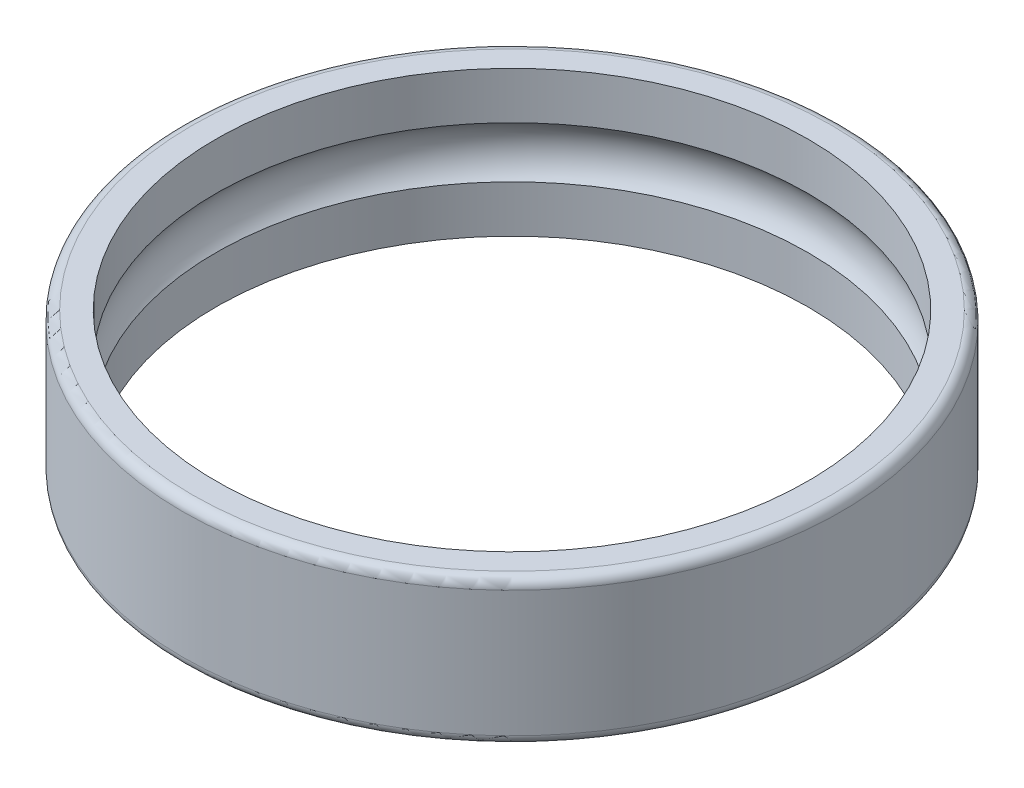
ISO-10303-21;
HEADER;
FILE_DESCRIPTION(('STEP AP214'),'2;1');
FILE_NAME('part.step','',(''),(''),'','','');
FILE_SCHEMA(('AUTOMOTIVE_DESIGN { 1 0 10303 214 1 1 1 1 }'));
ENDSEC;
DATA;
#1=APPLICATION_CONTEXT('core data for automotive mechanical design processes');
#2=APPLICATION_PROTOCOL_DEFINITION('international standard','automotive_design',2000,#1);
#3=PRODUCT_CONTEXT('',#1,'mechanical');
#4=PRODUCT('Part','Part','',(#3));
#5=PRODUCT_RELATED_PRODUCT_CATEGORY('part','',(#4));
#6=PRODUCT_DEFINITION_FORMATION('','',#4);
#7=PRODUCT_DEFINITION_CONTEXT('part definition',#1,'design');
#8=PRODUCT_DEFINITION('design','',#6,#7);
#9=PRODUCT_DEFINITION_SHAPE('','',#8);
#10=(LENGTH_UNIT() NAMED_UNIT(*) SI_UNIT(.MILLI.,.METRE.));
#11=(NAMED_UNIT(*) PLANE_ANGLE_UNIT() SI_UNIT($,.RADIAN.));
#12=(NAMED_UNIT(*) SI_UNIT($,.STERADIAN.) SOLID_ANGLE_UNIT());
#13=UNCERTAINTY_MEASURE_WITH_UNIT(LENGTH_MEASURE(1.E-05),#10,'distance_accuracy_value','');
#14=(GEOMETRIC_REPRESENTATION_CONTEXT(3) GLOBAL_UNCERTAINTY_ASSIGNED_CONTEXT((#13)) GLOBAL_UNIT_ASSIGNED_CONTEXT((#10,
#11,#12)) REPRESENTATION_CONTEXT('',''));
#15=CARTESIAN_POINT('',(0.,0.,0.));
#16=DIRECTION('',(0.,0.,1.));
#17=DIRECTION('',(1.,0.,0.));
#18=AXIS2_PLACEMENT_3D('',#15,#16,#17);
#19=CARTESIAN_POINT('',(0.,7.5,0.));
#20=DIRECTION('',(0.,-1.,0.));
#21=DIRECTION('',(0.,0.,-1.));
#22=AXIS2_PLACEMENT_3D('',#19,#20,#21);
#23=TOROIDAL_SURFACE('',#22,27.5875,3.96875);
#24=CARTESIAN_POINT('',(0.,4.85905882070426,0.));
#25=DIRECTION('',(0.,-1.,0.));
#26=DIRECTION('',(0.,0.,-1.));
#27=AXIS2_PLACEMENT_3D('',#24,#25,#26);
#28=CIRCLE('',#27,30.55);
#29=CARTESIAN_POINT('',(0.,4.85905882070426,-30.55));
#30=VERTEX_POINT('',#29);
#31=EDGE_CURVE('E63',#30,#30,#28,.T.);
#32=ORIENTED_EDGE('',*,*,#31,.T.);
#33=EDGE_LOOP('',(#32));
#34=FACE_BOUND('',#33,.T.);
#35=CARTESIAN_POINT('',(0.,10.1409411792957,0.));
#36=DIRECTION('',(0.,-1.,0.));
#37=DIRECTION('',(0.,0.,-1.));
#38=AXIS2_PLACEMENT_3D('',#35,#36,#37);
#39=CIRCLE('',#38,30.55);
#40=CARTESIAN_POINT('',(0.,10.1409411792957,-30.55));
#41=VERTEX_POINT('',#40);
#42=EDGE_CURVE('E54',#41,#41,#39,.T.);
#43=ORIENTED_EDGE('',*,*,#42,.F.);
#44=EDGE_LOOP('',(#43));
#45=FACE_BOUND('',#44,.T.);
#46=ADVANCED_FACE('F34',(#34,#45),#23,.F.);
#47=CARTESIAN_POINT('',(0.,0.,0.));
#48=DIRECTION('',(0.,-1.,0.));
#49=DIRECTION('',(0.,0.,-1.));
#50=AXIS2_PLACEMENT_3D('',#47,#48,#49);
#51=CYLINDRICAL_SURFACE('',#50,30.55);
#52=CARTESIAN_POINT('',(0.,15.,0.));
#53=DIRECTION('',(0.,-1.,0.));
#54=DIRECTION('',(0.,0.,-1.));
#55=AXIS2_PLACEMENT_3D('',#52,#53,#54);
#56=CIRCLE('',#55,30.55);
#57=CARTESIAN_POINT('',(0.,15.,-30.55));
#58=VERTEX_POINT('',#57);
#59=EDGE_CURVE('E57',#58,#58,#56,.T.);
#60=ORIENTED_EDGE('',*,*,#59,.F.);
#61=EDGE_LOOP('',(#60));
#62=FACE_BOUND('',#61,.T.);
#63=ORIENTED_EDGE('',*,*,#42,.T.);
#64=EDGE_LOOP('',(#63));
#65=FACE_BOUND('',#64,.T.);
#66=ADVANCED_FACE('F75',(#62,#65),#51,.F.);
#67=CARTESIAN_POINT('',(0.,15.,0.));
#68=DIRECTION('',(0.,-1.,0.));
#69=DIRECTION('',(0.,0.,-1.));
#70=AXIS2_PLACEMENT_3D('',#67,#68,#69);
#71=PLANE('',#70);
#72=CARTESIAN_POINT('',(0.,15.,0.));
#73=DIRECTION('',(0.,-1.,0.));
#74=DIRECTION('',(0.,0.,-1.));
#75=AXIS2_PLACEMENT_3D('',#72,#73,#74);
#76=CIRCLE('',#75,33.);
#77=CARTESIAN_POINT('',(0.,15.,-33.));
#78=VERTEX_POINT('',#77);
#79=EDGE_CURVE('E10',#78,#78,#76,.F.);
#80=ORIENTED_EDGE('',*,*,#79,.T.);
#81=EDGE_LOOP('',(#80));
#82=FACE_BOUND('',#81,.T.);
#83=ORIENTED_EDGE('',*,*,#59,.T.);
#84=EDGE_LOOP('',(#83));
#85=FACE_BOUND('',#84,.T.);
#86=ADVANCED_FACE('F85',(#82,#85),#71,.F.);
#87=CARTESIAN_POINT('',(0.,0.,0.));
#88=DIRECTION('',(0.,-1.,0.));
#89=DIRECTION('',(0.,0.,-1.));
#90=AXIS2_PLACEMENT_3D('',#87,#88,#89);
#91=CYLINDRICAL_SURFACE('',#90,34.);
#92=CARTESIAN_POINT('',(0.,1.,0.));
#93=DIRECTION('',(0.,-1.,0.));
#94=DIRECTION('',(0.,0.,-1.));
#95=AXIS2_PLACEMENT_3D('',#92,#93,#94);
#96=CIRCLE('',#95,34.);
#97=CARTESIAN_POINT('',(0.,1.,-34.));
#98=VERTEX_POINT('',#97);
#99=EDGE_CURVE('E41',#98,#98,#96,.F.);
#100=ORIENTED_EDGE('',*,*,#99,.T.);
#101=EDGE_LOOP('',(#100));
#102=FACE_BOUND('',#101,.T.);
#103=CARTESIAN_POINT('',(0.,14.,0.));
#104=DIRECTION('',(0.,-1.,0.));
#105=DIRECTION('',(0.,0.,-1.));
#106=AXIS2_PLACEMENT_3D('',#103,#104,#105);
#107=CIRCLE('',#106,34.);
#108=CARTESIAN_POINT('',(0.,14.,-34.));
#109=VERTEX_POINT('',#108);
#110=EDGE_CURVE('E45',#109,#109,#107,.T.);
#111=ORIENTED_EDGE('',*,*,#110,.T.);
#112=EDGE_LOOP('',(#111));
#113=FACE_BOUND('',#112,.T.);
#114=ADVANCED_FACE('F79',(#102,#113),#91,.T.);
#115=CARTESIAN_POINT('',(0.,0.,0.));
#116=DIRECTION('',(0.,-1.,0.));
#117=DIRECTION('',(0.,0.,-1.));
#118=AXIS2_PLACEMENT_3D('',#115,#116,#117);
#119=PLANE('',#118);
#120=CARTESIAN_POINT('',(0.,0.,0.));
#121=DIRECTION('',(0.,-1.,0.));
#122=DIRECTION('',(0.,0.,-1.));
#123=AXIS2_PLACEMENT_3D('',#120,#121,#122);
#124=CIRCLE('',#123,33.);
#125=CARTESIAN_POINT('',(0.,0.,-33.));
#126=VERTEX_POINT('',#125);
#127=EDGE_CURVE('E49',#126,#126,#124,.T.);
#128=ORIENTED_EDGE('',*,*,#127,.T.);
#129=EDGE_LOOP('',(#128));
#130=FACE_BOUND('',#129,.T.);
#131=CARTESIAN_POINT('',(0.,0.,0.));
#132=DIRECTION('',(0.,-1.,0.));
#133=DIRECTION('',(0.,0.,-1.));
#134=AXIS2_PLACEMENT_3D('',#131,#132,#133);
#135=CIRCLE('',#134,30.55);
#136=CARTESIAN_POINT('',(0.,0.,-30.55));
#137=VERTEX_POINT('',#136);
#138=EDGE_CURVE('E60',#137,#137,#135,.T.);
#139=ORIENTED_EDGE('',*,*,#138,.F.);
#140=EDGE_LOOP('',(#139));
#141=FACE_BOUND('',#140,.T.);
#142=ADVANCED_FACE('F73',(#130,#141),#119,.T.);
#143=ORIENTED_EDGE('',*,*,#31,.F.);
#144=EDGE_LOOP('',(#143));
#145=FACE_BOUND('',#144,.T.);
#146=ORIENTED_EDGE('',*,*,#138,.T.);
#147=EDGE_LOOP('',(#146));
#148=FACE_BOUND('',#147,.T.);
#149=ADVANCED_FACE('F69',(#145,#148),#51,.F.);
#150=CARTESIAN_POINT('',(0.,1.,0.));
#151=DIRECTION('',(0.,-1.,0.));
#152=DIRECTION('',(0.,0.,-1.));
#153=AXIS2_PLACEMENT_3D('',#150,#151,#152);
#154=TOROIDAL_SURFACE('',#153,33.,1.);
#155=ORIENTED_EDGE('',*,*,#99,.F.);
#156=EDGE_LOOP('',(#155));
#157=FACE_BOUND('',#156,.T.);
#158=ORIENTED_EDGE('',*,*,#127,.F.);
#159=EDGE_LOOP('',(#158));
#160=FACE_BOUND('',#159,.T.);
#161=ADVANCED_FACE('F72',(#157,#160),#154,.T.);
#162=CARTESIAN_POINT('',(0.,14.,0.));
#163=DIRECTION('',(0.,-1.,0.));
#164=DIRECTION('',(0.,0.,-1.));
#165=AXIS2_PLACEMENT_3D('',#162,#163,#164);
#166=TOROIDAL_SURFACE('',#165,33.,1.);
#167=ORIENTED_EDGE('',*,*,#79,.F.);
#168=EDGE_LOOP('',(#167));
#169=FACE_BOUND('',#168,.T.);
#170=ORIENTED_EDGE('',*,*,#110,.F.);
#171=EDGE_LOOP('',(#170));
#172=FACE_BOUND('',#171,.T.);
#173=ADVANCED_FACE('F36',(#169,#172),#166,.T.);
#174=CLOSED_SHELL('',(#46,#66,#86,#114,#142,#149,#161,#173));
#175=MANIFOLD_SOLID_BREP('B2',#174);
#176=ADVANCED_BREP_SHAPE_REPRESENTATION('',(#18,#175),#14);
#177=SHAPE_DEFINITION_REPRESENTATION(#9,#176);
ENDSEC;
END-ISO-10303-21;
